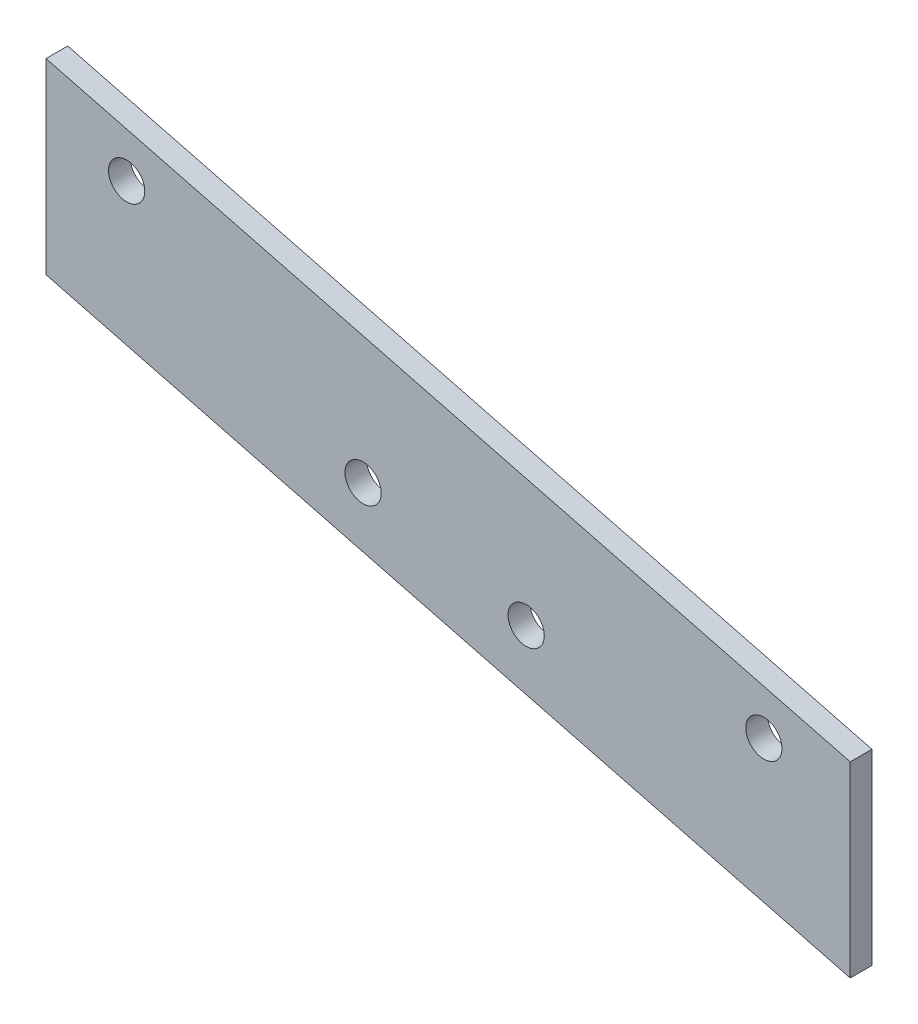
ISO-10303-21;
HEADER;
FILE_DESCRIPTION(('STEP AP214'),'2;1');
FILE_NAME('part.step','',(''),(''),'','','');
FILE_SCHEMA(('AUTOMOTIVE_DESIGN { 1 0 10303 214 1 1 1 1 }'));
ENDSEC;
DATA;
#1=APPLICATION_CONTEXT('core data for automotive mechanical design processes');
#2=APPLICATION_PROTOCOL_DEFINITION('international standard','automotive_design',2000,#1);
#3=PRODUCT_CONTEXT('',#1,'mechanical');
#4=PRODUCT('Part','Part','',(#3));
#5=PRODUCT_RELATED_PRODUCT_CATEGORY('part','',(#4));
#6=PRODUCT_DEFINITION_FORMATION('','',#4);
#7=PRODUCT_DEFINITION_CONTEXT('part definition',#1,'design');
#8=PRODUCT_DEFINITION('design','',#6,#7);
#9=PRODUCT_DEFINITION_SHAPE('','',#8);
#10=(LENGTH_UNIT() NAMED_UNIT(*) SI_UNIT(.MILLI.,.METRE.));
#11=(NAMED_UNIT(*) PLANE_ANGLE_UNIT() SI_UNIT($,.RADIAN.));
#12=(NAMED_UNIT(*) SI_UNIT($,.STERADIAN.) SOLID_ANGLE_UNIT());
#13=UNCERTAINTY_MEASURE_WITH_UNIT(LENGTH_MEASURE(1.E-05),#10,'distance_accuracy_value','');
#14=(GEOMETRIC_REPRESENTATION_CONTEXT(3) GLOBAL_UNCERTAINTY_ASSIGNED_CONTEXT((#13)) GLOBAL_UNIT_ASSIGNED_CONTEXT((#10,
#11,#12)) REPRESENTATION_CONTEXT('',''));
#15=CARTESIAN_POINT('',(0.,0.,0.));
#16=DIRECTION('',(0.,0.,1.));
#17=DIRECTION('',(1.,0.,0.));
#18=AXIS2_PLACEMENT_3D('',#15,#16,#17);
#19=CARTESIAN_POINT('',(110.897531804756,-28.535548700055,3.));
#20=DIRECTION('',(0.249197002009039,0.968452814642875,0.));
#21=DIRECTION('',(-0.968452814642875,0.249197002009039,0.));
#22=AXIS2_PLACEMENT_3D('',#19,#20,#21);
#23=PLANE('',#22);
#24=DIRECTION('',(0.968452814642875,-0.249197002009039,0.));
#25=VECTOR('',#24,1.);
#26=CARTESIAN_POINT('',(110.897531804756,-28.535548700055,0.));
#27=LINE('',#26,#25);
#28=CARTESIAN_POINT('',(0.,0.,0.));
#29=VERTEX_POINT('',#28);
#30=CARTESIAN_POINT('',(110.897531804756,-28.535548700055,0.));
#31=VERTEX_POINT('',#30);
#32=EDGE_CURVE('E107',#29,#31,#27,.T.);
#33=ORIENTED_EDGE('',*,*,#32,.T.);
#34=DIRECTION('',(0.,0.,-1.));
#35=VECTOR('',#34,1.);
#36=CARTESIAN_POINT('',(110.897531804756,-28.535548700055,3.));
#37=LINE('',#36,#35);
#38=CARTESIAN_POINT('',(110.897531804756,-28.535548700055,3.));
#39=VERTEX_POINT('',#38);
#40=EDGE_CURVE('E11',#39,#31,#37,.T.);
#41=ORIENTED_EDGE('',*,*,#40,.F.);
#42=DIRECTION('',(0.968452814642875,-0.249197002009039,0.));
#43=VECTOR('',#42,1.);
#44=CARTESIAN_POINT('',(110.897531804756,-28.535548700055,3.));
#45=LINE('',#44,#43);
#46=CARTESIAN_POINT('',(0.,0.,3.));
#47=VERTEX_POINT('',#46);
#48=EDGE_CURVE('E91',#47,#39,#45,.T.);
#49=ORIENTED_EDGE('',*,*,#48,.F.);
#50=DIRECTION('',(0.,0.,-1.));
#51=VECTOR('',#50,1.);
#52=CARTESIAN_POINT('',(0.,0.,3.));
#53=LINE('',#52,#51);
#54=EDGE_CURVE('E103',#47,#29,#53,.T.);
#55=ORIENTED_EDGE('',*,*,#54,.T.);
#56=EDGE_LOOP('',(#33,#41,#49,#55));
#57=FACE_BOUND('',#56,.T.);
#58=ADVANCED_FACE('F39',(#57),#23,.F.);
#59=CARTESIAN_POINT('',(110.897531804756,-2.7211779614879,3.));
#60=DIRECTION('',(-1.,0.,0.));
#61=DIRECTION('',(0.,-1.,0.));
#62=AXIS2_PLACEMENT_3D('',#59,#60,#61);
#63=PLANE('',#62);
#64=DIRECTION('',(0.,1.,0.));
#65=VECTOR('',#64,1.);
#66=CARTESIAN_POINT('',(110.897531804756,-2.7211779614879,0.));
#67=LINE('',#66,#65);
#68=CARTESIAN_POINT('',(110.897531804756,-2.7211779614879,0.));
#69=VERTEX_POINT('',#68);
#70=EDGE_CURVE('E96',#31,#69,#67,.T.);
#71=ORIENTED_EDGE('',*,*,#70,.T.);
#72=DIRECTION('',(0.,0.,-1.));
#73=VECTOR('',#72,1.);
#74=CARTESIAN_POINT('',(110.897531804756,-2.7211779614879,3.));
#75=LINE('',#74,#73);
#76=CARTESIAN_POINT('',(110.897531804756,-2.7211779614879,3.));
#77=VERTEX_POINT('',#76);
#78=EDGE_CURVE('E48',#77,#69,#75,.T.);
#79=ORIENTED_EDGE('',*,*,#78,.F.);
#80=DIRECTION('',(0.,1.,0.));
#81=VECTOR('',#80,1.);
#82=CARTESIAN_POINT('',(110.897531804756,-2.7211779614879,3.));
#83=LINE('',#82,#81);
#84=EDGE_CURVE('E86',#39,#77,#83,.T.);
#85=ORIENTED_EDGE('',*,*,#84,.F.);
#86=ORIENTED_EDGE('',*,*,#40,.T.);
#87=EDGE_LOOP('',(#71,#79,#85,#86));
#88=FACE_BOUND('',#87,.T.);
#89=ADVANCED_FACE('F95',(#88),#63,.F.);
#90=CARTESIAN_POINT('',(0.,25.8143707385671,3.));
#91=DIRECTION('',(-0.249197002009039,-0.968452814642875,0.));
#92=DIRECTION('',(0.968452814642875,-0.249197002009039,0.));
#93=AXIS2_PLACEMENT_3D('',#90,#91,#92);
#94=PLANE('',#93);
#95=DIRECTION('',(-0.968452814642875,0.249197002009039,0.));
#96=VECTOR('',#95,1.);
#97=CARTESIAN_POINT('',(0.,25.8143707385671,0.));
#98=LINE('',#97,#96);
#99=CARTESIAN_POINT('',(0.,25.8143707385671,0.));
#100=VERTEX_POINT('',#99);
#101=EDGE_CURVE('E73',#69,#100,#98,.T.);
#102=ORIENTED_EDGE('',*,*,#101,.T.);
#103=DIRECTION('',(0.,0.,-1.));
#104=VECTOR('',#103,1.);
#105=CARTESIAN_POINT('',(0.,25.8143707385671,3.));
#106=LINE('',#105,#104);
#107=CARTESIAN_POINT('',(0.,25.8143707385671,3.));
#108=VERTEX_POINT('',#107);
#109=EDGE_CURVE('E98',#108,#100,#106,.T.);
#110=ORIENTED_EDGE('',*,*,#109,.F.);
#111=DIRECTION('',(-0.968452814642875,0.249197002009039,0.));
#112=VECTOR('',#111,1.);
#113=CARTESIAN_POINT('',(0.,25.8143707385671,3.));
#114=LINE('',#113,#112);
#115=EDGE_CURVE('E89',#77,#108,#114,.T.);
#116=ORIENTED_EDGE('',*,*,#115,.F.);
#117=ORIENTED_EDGE('',*,*,#78,.T.);
#118=EDGE_LOOP('',(#102,#110,#116,#117));
#119=FACE_BOUND('',#118,.T.);
#120=ADVANCED_FACE('F99',(#119),#94,.F.);
#121=CARTESIAN_POINT('',(0.,0.,3.));
#122=DIRECTION('',(1.,0.,0.));
#123=DIRECTION('',(0.,1.,0.));
#124=AXIS2_PLACEMENT_3D('',#121,#122,#123);
#125=PLANE('',#124);
#126=DIRECTION('',(0.,-1.,0.));
#127=VECTOR('',#126,1.);
#128=CARTESIAN_POINT('',(0.,0.,0.));
#129=LINE('',#128,#127);
#130=EDGE_CURVE('E79',#100,#29,#129,.T.);
#131=ORIENTED_EDGE('',*,*,#130,.T.);
#132=ORIENTED_EDGE('',*,*,#54,.F.);
#133=DIRECTION('',(0.,-1.,0.));
#134=VECTOR('',#133,1.);
#135=CARTESIAN_POINT('',(0.,0.,3.));
#136=LINE('',#135,#134);
#137=EDGE_CURVE('E56',#108,#47,#136,.T.);
#138=ORIENTED_EDGE('',*,*,#137,.F.);
#139=ORIENTED_EDGE('',*,*,#109,.T.);
#140=EDGE_LOOP('',(#131,#132,#138,#139));
#141=FACE_BOUND('',#140,.T.);
#142=ADVANCED_FACE('F121',(#141),#125,.F.);
#143=CARTESIAN_POINT('',(0.,0.,3.));
#144=DIRECTION('',(0.,0.,-1.));
#145=DIRECTION('',(-1.,0.,0.));
#146=AXIS2_PLACEMENT_3D('',#143,#144,#145);
#147=PLANE('',#146);
#148=CARTESIAN_POINT('',(11.1178383121002,16.7581401782473,3.));
#149=DIRECTION('',(0.,0.,1.));
#150=DIRECTION('',(1.,0.,0.));
#151=AXIS2_PLACEMENT_3D('',#148,#149,#150);
#152=CIRCLE('',#151,2.49999999999999);
#153=CARTESIAN_POINT('',(13.6178383121002,16.7581401782473,3.));
#154=VERTEX_POINT('',#153);
#155=EDGE_CURVE('E155',#154,#154,#152,.T.);
#156=ORIENTED_EDGE('',*,*,#155,.F.);
#157=EDGE_LOOP('',(#156));
#158=FACE_BOUND('',#157,.T.);
#159=CARTESIAN_POINT('',(43.7208023170526,-2.98940001935658,3.));
#160=DIRECTION('',(0.,0.,1.));
#161=DIRECTION('',(1.,0.,0.));
#162=AXIS2_PLACEMENT_3D('',#159,#160,#161);
#163=CIRCLE('',#162,2.49999999999999);
#164=CARTESIAN_POINT('',(46.2208023170526,-2.98940001935658,3.));
#165=VERTEX_POINT('',#164);
#166=EDGE_CURVE('E147',#165,#165,#163,.T.);
#167=ORIENTED_EDGE('',*,*,#166,.F.);
#168=EDGE_LOOP('',(#167));
#169=FACE_BOUND('',#168,.T.);
#170=CARTESIAN_POINT('',(66.2082766730602,-8.77575440600646,3.));
#171=DIRECTION('',(0.,0.,1.));
#172=DIRECTION('',(1.,0.,0.));
#173=AXIS2_PLACEMENT_3D('',#170,#171,#172);
#174=CIRCLE('',#173,2.49999999999999);
#175=CARTESIAN_POINT('',(68.7082766730602,-8.77575440600646,3.));
#176=VERTEX_POINT('',#175);
#177=EDGE_CURVE('E139',#176,#176,#174,.T.);
#178=ORIENTED_EDGE('',*,*,#177,.F.);
#179=EDGE_LOOP('',(#178));
#180=FACE_BOUND('',#179,.T.);
#181=CARTESIAN_POINT('',(98.9855621846483,-5.85150381403285,3.));
#182=DIRECTION('',(0.,0.,1.));
#183=DIRECTION('',(1.,0.,0.));
#184=AXIS2_PLACEMENT_3D('',#181,#182,#183);
#185=CIRCLE('',#184,2.49999999999999);
#186=CARTESIAN_POINT('',(101.485562184648,-5.85150381403285,3.));
#187=VERTEX_POINT('',#186);
#188=EDGE_CURVE('E131',#187,#187,#185,.T.);
#189=ORIENTED_EDGE('',*,*,#188,.F.);
#190=EDGE_LOOP('',(#189));
#191=FACE_BOUND('',#190,.T.);
#192=ORIENTED_EDGE('',*,*,#48,.T.);
#193=ORIENTED_EDGE('',*,*,#84,.T.);
#194=ORIENTED_EDGE('',*,*,#115,.T.);
#195=ORIENTED_EDGE('',*,*,#137,.T.);
#196=EDGE_LOOP('',(#192,#193,#194,#195));
#197=FACE_BOUND('',#196,.T.);
#198=ADVANCED_FACE('F87',(#158,#169,#180,#191,#197),#147,.F.);
#199=CARTESIAN_POINT('',(0.,0.,0.));
#200=DIRECTION('',(0.,0.,-1.));
#201=DIRECTION('',(-1.,0.,0.));
#202=AXIS2_PLACEMENT_3D('',#199,#200,#201);
#203=PLANE('',#202);
#204=CARTESIAN_POINT('',(11.1178383121002,16.7581401782473,0.));
#205=DIRECTION('',(0.,0.,1.));
#206=DIRECTION('',(1.,0.,0.));
#207=AXIS2_PLACEMENT_3D('',#204,#205,#206);
#208=CIRCLE('',#207,2.5);
#209=CARTESIAN_POINT('',(13.6178383121002,16.7581401782473,0.));
#210=VERTEX_POINT('',#209);
#211=EDGE_CURVE('E151',#210,#210,#208,.T.);
#212=ORIENTED_EDGE('',*,*,#211,.T.);
#213=EDGE_LOOP('',(#212));
#214=FACE_BOUND('',#213,.T.);
#215=CARTESIAN_POINT('',(43.7208023170526,-2.98940001935658,0.));
#216=DIRECTION('',(0.,0.,1.));
#217=DIRECTION('',(1.,0.,0.));
#218=AXIS2_PLACEMENT_3D('',#215,#216,#217);
#219=CIRCLE('',#218,2.5);
#220=CARTESIAN_POINT('',(46.2208023170526,-2.98940001935658,0.));
#221=VERTEX_POINT('',#220);
#222=EDGE_CURVE('E143',#221,#221,#219,.T.);
#223=ORIENTED_EDGE('',*,*,#222,.T.);
#224=EDGE_LOOP('',(#223));
#225=FACE_BOUND('',#224,.T.);
#226=CARTESIAN_POINT('',(66.2082766730602,-8.77575440600646,0.));
#227=DIRECTION('',(0.,0.,1.));
#228=DIRECTION('',(1.,0.,0.));
#229=AXIS2_PLACEMENT_3D('',#226,#227,#228);
#230=CIRCLE('',#229,2.5);
#231=CARTESIAN_POINT('',(68.7082766730602,-8.77575440600646,0.));
#232=VERTEX_POINT('',#231);
#233=EDGE_CURVE('E135',#232,#232,#230,.T.);
#234=ORIENTED_EDGE('',*,*,#233,.T.);
#235=EDGE_LOOP('',(#234));
#236=FACE_BOUND('',#235,.T.);
#237=CARTESIAN_POINT('',(98.9855621846483,-5.85150381403285,0.));
#238=DIRECTION('',(0.,0.,1.));
#239=DIRECTION('',(1.,0.,0.));
#240=AXIS2_PLACEMENT_3D('',#237,#238,#239);
#241=CIRCLE('',#240,2.5);
#242=CARTESIAN_POINT('',(101.485562184648,-5.85150381403285,0.));
#243=VERTEX_POINT('',#242);
#244=EDGE_CURVE('E111',#243,#243,#241,.T.);
#245=ORIENTED_EDGE('',*,*,#244,.T.);
#246=EDGE_LOOP('',(#245));
#247=FACE_BOUND('',#246,.T.);
#248=ORIENTED_EDGE('',*,*,#32,.F.);
#249=ORIENTED_EDGE('',*,*,#130,.F.);
#250=ORIENTED_EDGE('',*,*,#101,.F.);
#251=ORIENTED_EDGE('',*,*,#70,.F.);
#252=EDGE_LOOP('',(#248,#249,#250,#251));
#253=FACE_BOUND('',#252,.T.);
#254=ADVANCED_FACE('F124',(#214,#225,#236,#247,#253),#203,.T.);
#255=CARTESIAN_POINT('',(98.9855621846483,-5.85150381403285,3.));
#256=DIRECTION('',(0.,0.,1.));
#257=DIRECTION('',(1.,0.,0.));
#258=AXIS2_PLACEMENT_3D('',#255,#256,#257);
#259=CYLINDRICAL_SURFACE('',#258,2.5);
#260=ORIENTED_EDGE('',*,*,#244,.F.);
#261=EDGE_LOOP('',(#260));
#262=FACE_BOUND('',#261,.T.);
#263=ORIENTED_EDGE('',*,*,#188,.T.);
#264=EDGE_LOOP('',(#263));
#265=FACE_BOUND('',#264,.T.);
#266=ADVANCED_FACE('F171',(#262,#265),#259,.F.);
#267=CARTESIAN_POINT('',(66.2082766730602,-8.77575440600646,3.));
#268=DIRECTION('',(0.,0.,1.));
#269=DIRECTION('',(1.,0.,0.));
#270=AXIS2_PLACEMENT_3D('',#267,#268,#269);
#271=CYLINDRICAL_SURFACE('',#270,2.5);
#272=ORIENTED_EDGE('',*,*,#233,.F.);
#273=EDGE_LOOP('',(#272));
#274=FACE_BOUND('',#273,.T.);
#275=ORIENTED_EDGE('',*,*,#177,.T.);
#276=EDGE_LOOP('',(#275));
#277=FACE_BOUND('',#276,.T.);
#278=ADVANCED_FACE('F173',(#274,#277),#271,.F.);
#279=CARTESIAN_POINT('',(43.7208023170526,-2.98940001935658,3.));
#280=DIRECTION('',(0.,0.,1.));
#281=DIRECTION('',(1.,0.,0.));
#282=AXIS2_PLACEMENT_3D('',#279,#280,#281);
#283=CYLINDRICAL_SURFACE('',#282,2.5);
#284=ORIENTED_EDGE('',*,*,#222,.F.);
#285=EDGE_LOOP('',(#284));
#286=FACE_BOUND('',#285,.T.);
#287=ORIENTED_EDGE('',*,*,#166,.T.);
#288=EDGE_LOOP('',(#287));
#289=FACE_BOUND('',#288,.T.);
#290=ADVANCED_FACE('F180',(#286,#289),#283,.F.);
#291=CARTESIAN_POINT('',(11.1178383121002,16.7581401782473,3.));
#292=DIRECTION('',(0.,0.,1.));
#293=DIRECTION('',(1.,0.,0.));
#294=AXIS2_PLACEMENT_3D('',#291,#292,#293);
#295=CYLINDRICAL_SURFACE('',#294,2.49999999999999);
#296=ORIENTED_EDGE('',*,*,#211,.F.);
#297=EDGE_LOOP('',(#296));
#298=FACE_BOUND('',#297,.T.);
#299=ORIENTED_EDGE('',*,*,#155,.T.);
#300=EDGE_LOOP('',(#299));
#301=FACE_BOUND('',#300,.T.);
#302=ADVANCED_FACE('F160',(#298,#301),#295,.F.);
#303=CLOSED_SHELL('',(#58,#89,#120,#142,#198,#254,#266,#278,#290,#302));
#304=MANIFOLD_SOLID_BREP('B2',#303);
#305=ADVANCED_BREP_SHAPE_REPRESENTATION('',(#18,#304),#14);
#306=SHAPE_DEFINITION_REPRESENTATION(#9,#305);
ENDSEC;
END-ISO-10303-21;
